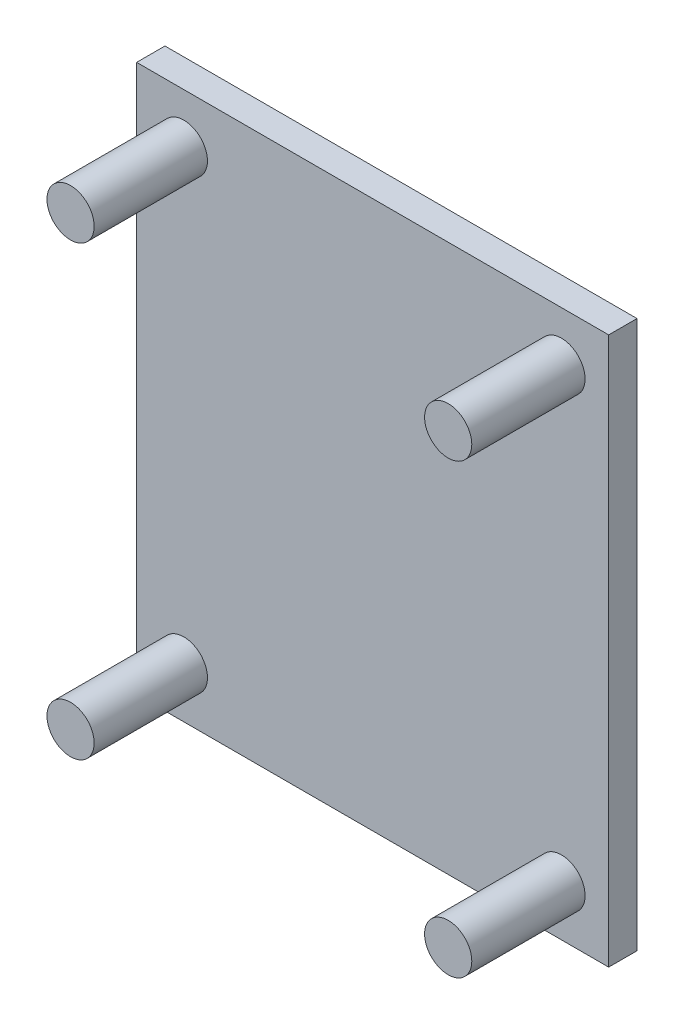
ISO-10303-21;
HEADER;
FILE_DESCRIPTION(('STEP AP214'),'2;1');
FILE_NAME('part.step','',(''),(''),'','','');
FILE_SCHEMA(('AUTOMOTIVE_DESIGN { 1 0 10303 214 1 1 1 1 }'));
ENDSEC;
DATA;
#1=APPLICATION_CONTEXT('core data for automotive mechanical design processes');
#2=APPLICATION_PROTOCOL_DEFINITION('international standard','automotive_design',2000,#1);
#3=PRODUCT_CONTEXT('',#1,'mechanical');
#4=PRODUCT('Part','Part','',(#3));
#5=PRODUCT_RELATED_PRODUCT_CATEGORY('part','',(#4));
#6=PRODUCT_DEFINITION_FORMATION('','',#4);
#7=PRODUCT_DEFINITION_CONTEXT('part definition',#1,'design');
#8=PRODUCT_DEFINITION('design','',#6,#7);
#9=PRODUCT_DEFINITION_SHAPE('','',#8);
#10=(LENGTH_UNIT() NAMED_UNIT(*) SI_UNIT(.MILLI.,.METRE.));
#11=(NAMED_UNIT(*) PLANE_ANGLE_UNIT() SI_UNIT($,.RADIAN.));
#12=(NAMED_UNIT(*) SI_UNIT($,.STERADIAN.) SOLID_ANGLE_UNIT());
#13=UNCERTAINTY_MEASURE_WITH_UNIT(LENGTH_MEASURE(1.E-05),#10,'distance_accuracy_value','');
#14=(GEOMETRIC_REPRESENTATION_CONTEXT(3) GLOBAL_UNCERTAINTY_ASSIGNED_CONTEXT((#13)) GLOBAL_UNIT_ASSIGNED_CONTEXT((#10,
#11,#12)) REPRESENTATION_CONTEXT('',''));
#15=CARTESIAN_POINT('',(0.,0.,0.));
#16=DIRECTION('',(0.,0.,1.));
#17=DIRECTION('',(1.,0.,0.));
#18=AXIS2_PLACEMENT_3D('',#15,#16,#17);
#19=CARTESIAN_POINT('',(-25.,29.,3.));
#20=DIRECTION('',(1.,0.,0.));
#21=DIRECTION('',(0.,0.,-1.));
#22=AXIS2_PLACEMENT_3D('',#19,#20,#21);
#23=PLANE('',#22);
#24=DIRECTION('',(0.,-1.,0.));
#25=VECTOR('',#24,1.);
#26=CARTESIAN_POINT('',(-25.,29.,0.));
#27=LINE('',#26,#25);
#28=CARTESIAN_POINT('',(-25.,29.,0.));
#29=VERTEX_POINT('',#28);
#30=CARTESIAN_POINT('',(-25.,-29.,0.));
#31=VERTEX_POINT('',#30);
#32=EDGE_CURVE('E100',#29,#31,#27,.T.);
#33=ORIENTED_EDGE('',*,*,#32,.T.);
#34=DIRECTION('',(0.,0.,-1.));
#35=VECTOR('',#34,1.);
#36=CARTESIAN_POINT('',(-25.,-29.,3.));
#37=LINE('',#36,#35);
#38=CARTESIAN_POINT('',(-25.,-29.,3.));
#39=VERTEX_POINT('',#38);
#40=EDGE_CURVE('E11',#39,#31,#37,.T.);
#41=ORIENTED_EDGE('',*,*,#40,.F.);
#42=DIRECTION('',(0.,-1.,0.));
#43=VECTOR('',#42,1.);
#44=CARTESIAN_POINT('',(-25.,29.,3.));
#45=LINE('',#44,#43);
#46=CARTESIAN_POINT('',(-25.,29.,3.));
#47=VERTEX_POINT('',#46);
#48=EDGE_CURVE('E88',#47,#39,#45,.T.);
#49=ORIENTED_EDGE('',*,*,#48,.F.);
#50=DIRECTION('',(0.,0.,-1.));
#51=VECTOR('',#50,1.);
#52=CARTESIAN_POINT('',(-25.,29.,3.));
#53=LINE('',#52,#51);
#54=EDGE_CURVE('E96',#47,#29,#53,.T.);
#55=ORIENTED_EDGE('',*,*,#54,.T.);
#56=EDGE_LOOP('',(#33,#41,#49,#55));
#57=FACE_BOUND('',#56,.T.);
#58=ADVANCED_FACE('F37',(#57),#23,.F.);
#59=CARTESIAN_POINT('',(-25.,-29.,3.));
#60=DIRECTION('',(0.,1.,0.));
#61=DIRECTION('',(0.,0.,1.));
#62=AXIS2_PLACEMENT_3D('',#59,#60,#61);
#63=PLANE('',#62);
#64=DIRECTION('',(1.,0.,0.));
#65=VECTOR('',#64,1.);
#66=CARTESIAN_POINT('',(-25.,-29.,0.));
#67=LINE('',#66,#65);
#68=CARTESIAN_POINT('',(25.,-29.,0.));
#69=VERTEX_POINT('',#68);
#70=EDGE_CURVE('E92',#31,#69,#67,.T.);
#71=ORIENTED_EDGE('',*,*,#70,.T.);
#72=DIRECTION('',(0.,0.,-1.));
#73=VECTOR('',#72,1.);
#74=CARTESIAN_POINT('',(25.,-29.,3.));
#75=LINE('',#74,#73);
#76=CARTESIAN_POINT('',(25.,-29.,3.));
#77=VERTEX_POINT('',#76);
#78=EDGE_CURVE('E45',#77,#69,#75,.T.);
#79=ORIENTED_EDGE('',*,*,#78,.F.);
#80=DIRECTION('',(1.,0.,0.));
#81=VECTOR('',#80,1.);
#82=CARTESIAN_POINT('',(-25.,-29.,3.));
#83=LINE('',#82,#81);
#84=EDGE_CURVE('E83',#39,#77,#83,.T.);
#85=ORIENTED_EDGE('',*,*,#84,.F.);
#86=ORIENTED_EDGE('',*,*,#40,.T.);
#87=EDGE_LOOP('',(#71,#79,#85,#86));
#88=FACE_BOUND('',#87,.T.);
#89=ADVANCED_FACE('F91',(#88),#63,.F.);
#90=CARTESIAN_POINT('',(25.,-29.,3.));
#91=DIRECTION('',(-1.,0.,0.));
#92=DIRECTION('',(0.,0.,1.));
#93=AXIS2_PLACEMENT_3D('',#90,#91,#92);
#94=PLANE('',#93);
#95=DIRECTION('',(0.,1.,0.));
#96=VECTOR('',#95,1.);
#97=CARTESIAN_POINT('',(25.,-29.,0.));
#98=LINE('',#97,#96);
#99=CARTESIAN_POINT('',(25.,29.,0.));
#100=VERTEX_POINT('',#99);
#101=EDGE_CURVE('E70',#69,#100,#98,.T.);
#102=ORIENTED_EDGE('',*,*,#101,.T.);
#103=DIRECTION('',(0.,0.,-1.));
#104=VECTOR('',#103,1.);
#105=CARTESIAN_POINT('',(25.,29.,3.));
#106=LINE('',#105,#104);
#107=CARTESIAN_POINT('',(25.,29.,3.));
#108=VERTEX_POINT('',#107);
#109=EDGE_CURVE('E93',#108,#100,#106,.T.);
#110=ORIENTED_EDGE('',*,*,#109,.F.);
#111=DIRECTION('',(0.,1.,0.));
#112=VECTOR('',#111,1.);
#113=CARTESIAN_POINT('',(25.,-29.,3.));
#114=LINE('',#113,#112);
#115=EDGE_CURVE('E86',#77,#108,#114,.T.);
#116=ORIENTED_EDGE('',*,*,#115,.F.);
#117=ORIENTED_EDGE('',*,*,#78,.T.);
#118=EDGE_LOOP('',(#102,#110,#116,#117));
#119=FACE_BOUND('',#118,.T.);
#120=ADVANCED_FACE('F94',(#119),#94,.F.);
#121=CARTESIAN_POINT('',(25.,29.,3.));
#122=DIRECTION('',(0.,-1.,0.));
#123=DIRECTION('',(0.,0.,-1.));
#124=AXIS2_PLACEMENT_3D('',#121,#122,#123);
#125=PLANE('',#124);
#126=DIRECTION('',(-1.,0.,0.));
#127=VECTOR('',#126,1.);
#128=CARTESIAN_POINT('',(25.,29.,0.));
#129=LINE('',#128,#127);
#130=EDGE_CURVE('E76',#100,#29,#129,.T.);
#131=ORIENTED_EDGE('',*,*,#130,.T.);
#132=ORIENTED_EDGE('',*,*,#54,.F.);
#133=DIRECTION('',(-1.,0.,0.));
#134=VECTOR('',#133,1.);
#135=CARTESIAN_POINT('',(25.,29.,3.));
#136=LINE('',#135,#134);
#137=EDGE_CURVE('E53',#108,#47,#136,.T.);
#138=ORIENTED_EDGE('',*,*,#137,.F.);
#139=ORIENTED_EDGE('',*,*,#109,.T.);
#140=EDGE_LOOP('',(#131,#132,#138,#139));
#141=FACE_BOUND('',#140,.T.);
#142=ADVANCED_FACE('F108',(#141),#125,.F.);
#143=CARTESIAN_POINT('',(0.,0.,3.));
#144=DIRECTION('',(0.,0.,1.));
#145=DIRECTION('',(1.,0.,0.));
#146=AXIS2_PLACEMENT_3D('',#143,#144,#145);
#147=PLANE('',#146);
#148=CARTESIAN_POINT('',(20.,23.7,3.));
#149=DIRECTION('',(0.,0.,1.));
#150=DIRECTION('',(1.,0.,0.));
#151=AXIS2_PLACEMENT_3D('',#148,#149,#150);
#152=CIRCLE('',#151,2.5);
#153=CARTESIAN_POINT('',(22.5,23.7,3.));
#154=VERTEX_POINT('',#153);
#155=EDGE_CURVE('E132',#154,#154,#152,.T.);
#156=ORIENTED_EDGE('',*,*,#155,.F.);
#157=EDGE_LOOP('',(#156));
#158=FACE_BOUND('',#157,.T.);
#159=CARTESIAN_POINT('',(20.,-23.7,3.));
#160=DIRECTION('',(0.,0.,1.));
#161=DIRECTION('',(1.,0.,0.));
#162=AXIS2_PLACEMENT_3D('',#159,#160,#161);
#163=CIRCLE('',#162,2.5);
#164=CARTESIAN_POINT('',(22.5,-23.7,3.));
#165=VERTEX_POINT('',#164);
#166=EDGE_CURVE('E126',#165,#165,#163,.T.);
#167=ORIENTED_EDGE('',*,*,#166,.F.);
#168=EDGE_LOOP('',(#167));
#169=FACE_BOUND('',#168,.T.);
#170=CARTESIAN_POINT('',(-20.,23.7,3.));
#171=DIRECTION('',(0.,0.,1.));
#172=DIRECTION('',(1.,0.,0.));
#173=AXIS2_PLACEMENT_3D('',#170,#171,#172);
#174=CIRCLE('',#173,2.5);
#175=CARTESIAN_POINT('',(-17.5,23.7,3.));
#176=VERTEX_POINT('',#175);
#177=EDGE_CURVE('E120',#176,#176,#174,.T.);
#178=ORIENTED_EDGE('',*,*,#177,.F.);
#179=EDGE_LOOP('',(#178));
#180=FACE_BOUND('',#179,.T.);
#181=CARTESIAN_POINT('',(-20.,-23.7,3.));
#182=DIRECTION('',(0.,0.,1.));
#183=DIRECTION('',(1.,0.,0.));
#184=AXIS2_PLACEMENT_3D('',#181,#182,#183);
#185=CIRCLE('',#184,2.5);
#186=CARTESIAN_POINT('',(-17.5,-23.7,3.));
#187=VERTEX_POINT('',#186);
#188=EDGE_CURVE('E114',#187,#187,#185,.T.);
#189=ORIENTED_EDGE('',*,*,#188,.F.);
#190=EDGE_LOOP('',(#189));
#191=FACE_BOUND('',#190,.T.);
#192=ORIENTED_EDGE('',*,*,#48,.T.);
#193=ORIENTED_EDGE('',*,*,#84,.T.);
#194=ORIENTED_EDGE('',*,*,#115,.T.);
#195=ORIENTED_EDGE('',*,*,#137,.T.);
#196=EDGE_LOOP('',(#192,#193,#194,#195));
#197=FACE_BOUND('',#196,.T.);
#198=ADVANCED_FACE('F84',(#158,#169,#180,#191,#197),#147,.T.);
#199=CARTESIAN_POINT('',(0.,0.,0.));
#200=DIRECTION('',(0.,0.,1.));
#201=DIRECTION('',(1.,0.,0.));
#202=AXIS2_PLACEMENT_3D('',#199,#200,#201);
#203=PLANE('',#202);
#204=ORIENTED_EDGE('',*,*,#32,.F.);
#205=ORIENTED_EDGE('',*,*,#130,.F.);
#206=ORIENTED_EDGE('',*,*,#101,.F.);
#207=ORIENTED_EDGE('',*,*,#70,.F.);
#208=EDGE_LOOP('',(#204,#205,#206,#207));
#209=FACE_BOUND('',#208,.T.);
#210=ADVANCED_FACE('F111',(#209),#203,.F.);
#211=CARTESIAN_POINT('',(-20.,-23.7,15.));
#212=DIRECTION('',(0.,0.,-1.));
#213=DIRECTION('',(-1.,0.,0.));
#214=AXIS2_PLACEMENT_3D('',#211,#212,#213);
#215=CYLINDRICAL_SURFACE('',#214,2.5);
#216=CARTESIAN_POINT('',(-20.,-23.7,15.));
#217=DIRECTION('',(0.,0.,1.));
#218=DIRECTION('',(1.,0.,0.));
#219=AXIS2_PLACEMENT_3D('',#216,#217,#218);
#220=CIRCLE('',#219,2.5);
#221=CARTESIAN_POINT('',(-17.5,-23.7,15.));
#222=VERTEX_POINT('',#221);
#223=EDGE_CURVE('E103',#222,#222,#220,.T.);
#224=ORIENTED_EDGE('',*,*,#223,.F.);
#225=EDGE_LOOP('',(#224));
#226=FACE_BOUND('',#225,.T.);
#227=ORIENTED_EDGE('',*,*,#188,.T.);
#228=EDGE_LOOP('',(#227));
#229=FACE_BOUND('',#228,.T.);
#230=ADVANCED_FACE('F156',(#226,#229),#215,.T.);
#231=CARTESIAN_POINT('',(-20.,-23.7,15.));
#232=DIRECTION('',(0.,0.,1.));
#233=DIRECTION('',(1.,0.,0.));
#234=AXIS2_PLACEMENT_3D('',#231,#232,#233);
#235=PLANE('',#234);
#236=ORIENTED_EDGE('',*,*,#223,.T.);
#237=EDGE_LOOP('',(#236));
#238=FACE_BOUND('',#237,.T.);
#239=ADVANCED_FACE('F158',(#238),#235,.T.);
#240=CARTESIAN_POINT('',(-20.,23.7,15.));
#241=DIRECTION('',(0.,0.,-1.));
#242=DIRECTION('',(-1.,0.,0.));
#243=AXIS2_PLACEMENT_3D('',#240,#241,#242);
#244=CYLINDRICAL_SURFACE('',#243,2.5);
#245=CARTESIAN_POINT('',(-20.,23.7,15.));
#246=DIRECTION('',(0.,0.,1.));
#247=DIRECTION('',(1.,0.,0.));
#248=AXIS2_PLACEMENT_3D('',#245,#246,#247);
#249=CIRCLE('',#248,2.5);
#250=CARTESIAN_POINT('',(-17.5,23.7,15.));
#251=VERTEX_POINT('',#250);
#252=EDGE_CURVE('E117',#251,#251,#249,.T.);
#253=ORIENTED_EDGE('',*,*,#252,.F.);
#254=EDGE_LOOP('',(#253));
#255=FACE_BOUND('',#254,.T.);
#256=ORIENTED_EDGE('',*,*,#177,.T.);
#257=EDGE_LOOP('',(#256));
#258=FACE_BOUND('',#257,.T.);
#259=ADVANCED_FACE('F165',(#255,#258),#244,.T.);
#260=CARTESIAN_POINT('',(-20.,23.7,15.));
#261=DIRECTION('',(0.,0.,1.));
#262=DIRECTION('',(1.,0.,0.));
#263=AXIS2_PLACEMENT_3D('',#260,#261,#262);
#264=PLANE('',#263);
#265=ORIENTED_EDGE('',*,*,#252,.T.);
#266=EDGE_LOOP('',(#265));
#267=FACE_BOUND('',#266,.T.);
#268=ADVANCED_FACE('F213',(#267),#264,.T.);
#269=CARTESIAN_POINT('',(20.,-23.7,15.));
#270=DIRECTION('',(0.,0.,-1.));
#271=DIRECTION('',(-1.,0.,0.));
#272=AXIS2_PLACEMENT_3D('',#269,#270,#271);
#273=CYLINDRICAL_SURFACE('',#272,2.5);
#274=CARTESIAN_POINT('',(20.,-23.7,15.));
#275=DIRECTION('',(0.,0.,1.));
#276=DIRECTION('',(1.,0.,0.));
#277=AXIS2_PLACEMENT_3D('',#274,#275,#276);
#278=CIRCLE('',#277,2.5);
#279=CARTESIAN_POINT('',(22.5,-23.7,15.));
#280=VERTEX_POINT('',#279);
#281=EDGE_CURVE('E123',#280,#280,#278,.T.);
#282=ORIENTED_EDGE('',*,*,#281,.F.);
#283=EDGE_LOOP('',(#282));
#284=FACE_BOUND('',#283,.T.);
#285=ORIENTED_EDGE('',*,*,#166,.T.);
#286=EDGE_LOOP('',(#285));
#287=FACE_BOUND('',#286,.T.);
#288=ADVANCED_FACE('F222',(#284,#287),#273,.T.);
#289=CARTESIAN_POINT('',(20.,-23.7,15.));
#290=DIRECTION('',(0.,0.,1.));
#291=DIRECTION('',(1.,0.,0.));
#292=AXIS2_PLACEMENT_3D('',#289,#290,#291);
#293=PLANE('',#292);
#294=ORIENTED_EDGE('',*,*,#281,.T.);
#295=EDGE_LOOP('',(#294));
#296=FACE_BOUND('',#295,.T.);
#297=ADVANCED_FACE('F143',(#296),#293,.T.);
#298=CARTESIAN_POINT('',(20.,23.7,15.));
#299=DIRECTION('',(0.,0.,-1.));
#300=DIRECTION('',(-1.,0.,0.));
#301=AXIS2_PLACEMENT_3D('',#298,#299,#300);
#302=CYLINDRICAL_SURFACE('',#301,2.5);
#303=CARTESIAN_POINT('',(20.,23.7,15.));
#304=DIRECTION('',(0.,0.,1.));
#305=DIRECTION('',(1.,0.,0.));
#306=AXIS2_PLACEMENT_3D('',#303,#304,#305);
#307=CIRCLE('',#306,2.5);
#308=CARTESIAN_POINT('',(22.5,23.7,15.));
#309=VERTEX_POINT('',#308);
#310=EDGE_CURVE('E129',#309,#309,#307,.T.);
#311=ORIENTED_EDGE('',*,*,#310,.F.);
#312=EDGE_LOOP('',(#311));
#313=FACE_BOUND('',#312,.T.);
#314=ORIENTED_EDGE('',*,*,#155,.T.);
#315=EDGE_LOOP('',(#314));
#316=FACE_BOUND('',#315,.T.);
#317=ADVANCED_FACE('F140',(#313,#316),#302,.T.);
#318=CARTESIAN_POINT('',(20.,23.7,15.));
#319=DIRECTION('',(0.,0.,1.));
#320=DIRECTION('',(1.,0.,0.));
#321=AXIS2_PLACEMENT_3D('',#318,#319,#320);
#322=PLANE('',#321);
#323=ORIENTED_EDGE('',*,*,#310,.T.);
#324=EDGE_LOOP('',(#323));
#325=FACE_BOUND('',#324,.T.);
#326=ADVANCED_FACE('F138',(#325),#322,.T.);
#327=CLOSED_SHELL('',(#58,#89,#120,#142,#198,#210,#230,#239,#259,#268,#288,#297,#317,#326));
#328=MANIFOLD_SOLID_BREP('B2',#327);
#329=ADVANCED_BREP_SHAPE_REPRESENTATION('',(#18,#328),#14);
#330=SHAPE_DEFINITION_REPRESENTATION(#9,#329);
ENDSEC;
END-ISO-10303-21;
